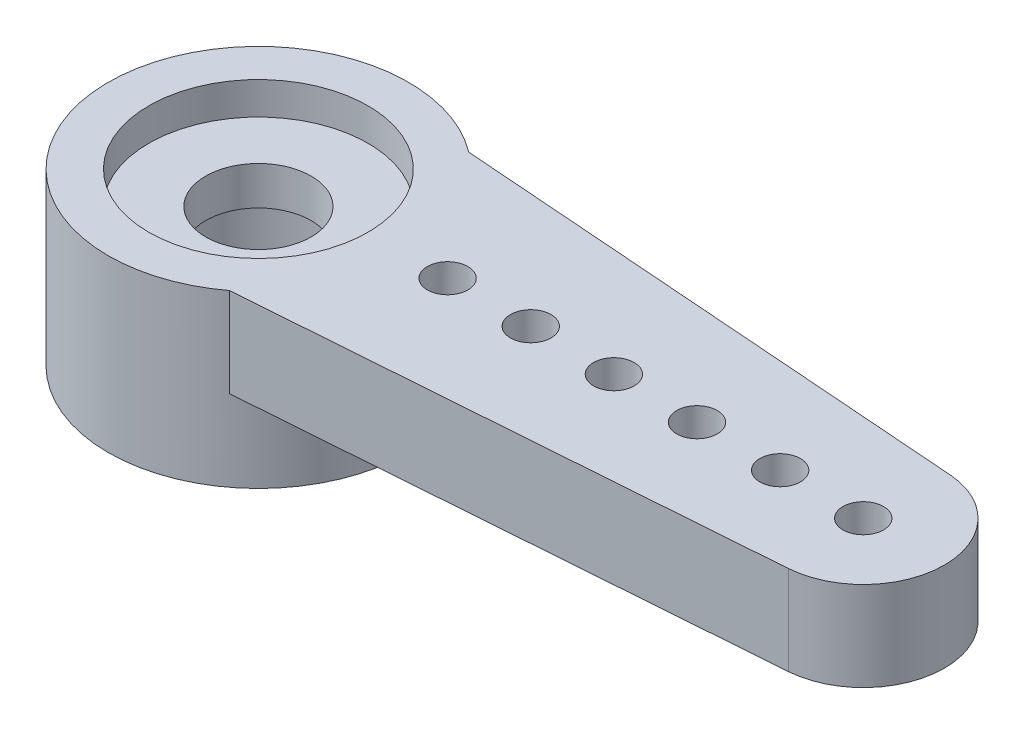
ISO-10303-21;
HEADER;
FILE_DESCRIPTION(('STEP AP214'),'2;1');
FILE_NAME('part.step','',(''),(''),'','','');
FILE_SCHEMA(('AUTOMOTIVE_DESIGN { 1 0 10303 214 1 1 1 1 }'));
ENDSEC;
DATA;
#1=APPLICATION_CONTEXT('core data for automotive mechanical design processes');
#2=APPLICATION_PROTOCOL_DEFINITION('international standard','automotive_design',2000,#1);
#3=PRODUCT_CONTEXT('',#1,'mechanical');
#4=PRODUCT('Part','Part','',(#3));
#5=PRODUCT_RELATED_PRODUCT_CATEGORY('part','',(#4));
#6=PRODUCT_DEFINITION_FORMATION('','',#4);
#7=PRODUCT_DEFINITION_CONTEXT('part definition',#1,'design');
#8=PRODUCT_DEFINITION('design','',#6,#7);
#9=PRODUCT_DEFINITION_SHAPE('','',#8);
#10=(LENGTH_UNIT() NAMED_UNIT(*) SI_UNIT(.MILLI.,.METRE.));
#11=(NAMED_UNIT(*) PLANE_ANGLE_UNIT() SI_UNIT($,.RADIAN.));
#12=(NAMED_UNIT(*) SI_UNIT($,.STERADIAN.) SOLID_ANGLE_UNIT());
#13=UNCERTAINTY_MEASURE_WITH_UNIT(LENGTH_MEASURE(1.E-05),#10,'distance_accuracy_value','');
#14=(GEOMETRIC_REPRESENTATION_CONTEXT(3) GLOBAL_UNCERTAINTY_ASSIGNED_CONTEXT((#13)) GLOBAL_UNIT_ASSIGNED_CONTEXT((#10,
#11,#12)) REPRESENTATION_CONTEXT('',''));
#15=CARTESIAN_POINT('',(0.,0.,0.));
#16=DIRECTION('',(0.,0.,1.));
#17=DIRECTION('',(1.,0.,0.));
#18=AXIS2_PLACEMENT_3D('',#15,#16,#17);
#19=CARTESIAN_POINT('',(0.,55.,0.));
#20=DIRECTION('',(0.,1.,0.));
#21=DIRECTION('',(0.,0.,1.));
#22=AXIS2_PLACEMENT_3D('',#19,#20,#21);
#23=CYLINDRICAL_SURFACE('',#22,3.7);
#24=CARTESIAN_POINT('',(0.,-2.,0.));
#25=DIRECTION('',(0.,1.,0.));
#26=DIRECTION('',(0.,0.,1.));
#27=AXIS2_PLACEMENT_3D('',#24,#25,#26);
#28=CIRCLE('',#27,3.7);
#29=CARTESIAN_POINT('',(0.,-2.,3.7));
#30=VERTEX_POINT('',#29);
#31=EDGE_CURVE('E152',#30,#30,#28,.T.);
#32=ORIENTED_EDGE('',*,*,#31,.T.);
#33=EDGE_LOOP('',(#32));
#34=FACE_BOUND('',#33,.T.);
#35=DIRECTION('',(0.,-1.,0.));
#36=VECTOR('',#35,1.);
#37=CARTESIAN_POINT('',(2.23327114341273,17.1604624043727,-2.95));
#38=LINE('',#37,#36);
#39=CARTESIAN_POINT('',(2.23327114341273,2.2,-2.95));
#40=VERTEX_POINT('',#39);
#41=CARTESIAN_POINT('',(2.23327114341273,0.,-2.95));
#42=VERTEX_POINT('',#41);
#43=EDGE_CURVE('E98',#40,#42,#38,.T.);
#44=ORIENTED_EDGE('',*,*,#43,.T.);
#45=CARTESIAN_POINT('',(0.,0.,0.));
#46=DIRECTION('',(0.,1.,0.));
#47=DIRECTION('',(0.,0.,1.));
#48=AXIS2_PLACEMENT_3D('',#45,#46,#47);
#49=CIRCLE('',#48,3.7);
#50=CARTESIAN_POINT('',(2.23327114341273,0.,2.95));
#51=VERTEX_POINT('',#50);
#52=EDGE_CURVE('E103',#51,#42,#49,.T.);
#53=ORIENTED_EDGE('',*,*,#52,.F.);
#54=DIRECTION('',(0.,-1.,0.));
#55=VECTOR('',#54,1.);
#56=CARTESIAN_POINT('',(2.23327114341273,17.1604624043727,2.95));
#57=LINE('',#56,#55);
#58=CARTESIAN_POINT('',(2.23327114341273,2.2,2.95));
#59=VERTEX_POINT('',#58);
#60=EDGE_CURVE('E112',#59,#51,#57,.T.);
#61=ORIENTED_EDGE('',*,*,#60,.F.);
#62=CARTESIAN_POINT('',(0.,2.2,0.));
#63=DIRECTION('',(0.,1.,0.));
#64=DIRECTION('',(0.,0.,1.));
#65=AXIS2_PLACEMENT_3D('',#62,#63,#64);
#66=CIRCLE('',#65,3.7);
#67=EDGE_CURVE('E58',#40,#59,#66,.T.);
#68=ORIENTED_EDGE('',*,*,#67,.F.);
#69=EDGE_LOOP('',(#44,#53,#61,#68));
#70=FACE_BOUND('',#69,.T.);
#71=ADVANCED_FACE('F38',(#34,#70),#23,.T.);
#72=CARTESIAN_POINT('',(3.7,2.2,0.));
#73=DIRECTION('',(0.,-1.,0.));
#74=DIRECTION('',(0.,0.,-1.));
#75=AXIS2_PLACEMENT_3D('',#72,#73,#74);
#76=PLANE('',#75);
#77=DIRECTION('',(-0.997231839723,0.,-0.0743549449780045));
#78=VECTOR('',#77,1.);
#79=CARTESIAN_POINT('',(0.231086891811972,2.2,-3.09928554618247));
#80=LINE('',#79,#78);
#81=CARTESIAN_POINT('',(15.048709889956,2.2,-1.994463679446));
#82=VERTEX_POINT('',#81);
#83=EDGE_CURVE('E97',#82,#40,#80,.T.);
#84=ORIENTED_EDGE('',*,*,#83,.T.);
#85=ORIENTED_EDGE('',*,*,#67,.T.);
#86=DIRECTION('',(-0.997231839723,0.,0.0743549449780045));
#87=VECTOR('',#86,1.);
#88=CARTESIAN_POINT('',(0.231086891811972,2.2,3.09928554618247));
#89=LINE('',#88,#87);
#90=CARTESIAN_POINT('',(15.048709889956,2.2,1.994463679446));
#91=VERTEX_POINT('',#90);
#92=EDGE_CURVE('E53',#91,#59,#89,.T.);
#93=ORIENTED_EDGE('',*,*,#92,.F.);
#94=CARTESIAN_POINT('',(14.9,2.2,0.));
#95=DIRECTION('',(0.,-1.,0.));
#96=DIRECTION('',(0.,0.,-1.));
#97=AXIS2_PLACEMENT_3D('',#94,#95,#96);
#98=CIRCLE('',#97,2.);
#99=EDGE_CURVE('E124',#82,#91,#98,.T.);
#100=ORIENTED_EDGE('',*,*,#99,.F.);
#101=EDGE_LOOP('',(#84,#85,#93,#100));
#102=FACE_BOUND('',#101,.T.);
#103=CARTESIAN_POINT('',(14.9,2.2,0.));
#104=DIRECTION('',(0.,-1.,0.));
#105=DIRECTION('',(0.,0.,-1.));
#106=AXIS2_PLACEMENT_3D('',#103,#104,#105);
#107=CIRCLE('',#106,0.500000000000001);
#108=CARTESIAN_POINT('',(14.9,2.2,-0.500000000000001));
#109=VERTEX_POINT('',#108);
#110=EDGE_CURVE('E121',#109,#109,#107,.T.);
#111=ORIENTED_EDGE('',*,*,#110,.T.);
#112=EDGE_LOOP('',(#111));
#113=FACE_BOUND('',#112,.T.);
#114=CARTESIAN_POINT('',(12.8520801303343,2.2,0.));
#115=DIRECTION('',(0.,-1.,0.));
#116=DIRECTION('',(0.,0.,-1.));
#117=AXIS2_PLACEMENT_3D('',#114,#115,#116);
#118=CIRCLE('',#117,0.500000000000001);
#119=CARTESIAN_POINT('',(12.8520801303343,2.2,-0.500000000000002));
#120=VERTEX_POINT('',#119);
#121=EDGE_CURVE('E118',#120,#120,#118,.T.);
#122=ORIENTED_EDGE('',*,*,#121,.T.);
#123=EDGE_LOOP('',(#122));
#124=FACE_BOUND('',#123,.T.);
#125=CARTESIAN_POINT('',(10.8041602606687,2.2,0.));
#126=DIRECTION('',(0.,-1.,0.));
#127=DIRECTION('',(0.,0.,-1.));
#128=AXIS2_PLACEMENT_3D('',#125,#126,#127);
#129=CIRCLE('',#128,0.500000000000001);
#130=CARTESIAN_POINT('',(10.8041602606687,2.2,-0.500000000000002));
#131=VERTEX_POINT('',#130);
#132=EDGE_CURVE('E115',#131,#131,#129,.T.);
#133=ORIENTED_EDGE('',*,*,#132,.T.);
#134=EDGE_LOOP('',(#133));
#135=FACE_BOUND('',#134,.T.);
#136=CARTESIAN_POINT('',(8.75624039100299,2.2,0.));
#137=DIRECTION('',(0.,-1.,0.));
#138=DIRECTION('',(0.,0.,-1.));
#139=AXIS2_PLACEMENT_3D('',#136,#137,#138);
#140=CIRCLE('',#139,0.500000000000001);
#141=CARTESIAN_POINT('',(8.75624039100299,2.2,-0.500000000000002));
#142=VERTEX_POINT('',#141);
#143=EDGE_CURVE('E111',#142,#142,#140,.T.);
#144=ORIENTED_EDGE('',*,*,#143,.T.);
#145=EDGE_LOOP('',(#144));
#146=FACE_BOUND('',#145,.T.);
#147=CARTESIAN_POINT('',(6.70832052133732,2.2,0.));
#148=DIRECTION('',(0.,-1.,0.));
#149=DIRECTION('',(0.,0.,-1.));
#150=AXIS2_PLACEMENT_3D('',#147,#148,#149);
#151=CIRCLE('',#150,0.500000000000001);
#152=CARTESIAN_POINT('',(6.70832052133732,2.2,-0.500000000000001));
#153=VERTEX_POINT('',#152);
#154=EDGE_CURVE('E108',#153,#153,#151,.T.);
#155=ORIENTED_EDGE('',*,*,#154,.T.);
#156=EDGE_LOOP('',(#155));
#157=FACE_BOUND('',#156,.T.);
#158=CARTESIAN_POINT('',(0.,2.2,0.));
#159=DIRECTION('',(0.,1.,0.));
#160=DIRECTION('',(0.,0.,1.));
#161=AXIS2_PLACEMENT_3D('',#158,#159,#160);
#162=CIRCLE('',#161,2.7);
#163=CARTESIAN_POINT('',(0.,2.2,2.7));
#164=VERTEX_POINT('',#163);
#165=EDGE_CURVE('E11',#164,#164,#162,.T.);
#166=ORIENTED_EDGE('',*,*,#165,.F.);
#167=EDGE_LOOP('',(#166));
#168=FACE_BOUND('',#167,.T.);
#169=CARTESIAN_POINT('',(4.66040065167165,2.2,0.));
#170=DIRECTION('',(0.,-1.,0.));
#171=DIRECTION('',(0.,0.,-1.));
#172=AXIS2_PLACEMENT_3D('',#169,#170,#171);
#173=CIRCLE('',#172,0.500000000000001);
#174=CARTESIAN_POINT('',(4.66040065167165,2.2,-0.500000000000002));
#175=VERTEX_POINT('',#174);
#176=EDGE_CURVE('E127',#175,#175,#173,.T.);
#177=ORIENTED_EDGE('',*,*,#176,.T.);
#178=EDGE_LOOP('',(#177));
#179=FACE_BOUND('',#178,.T.);
#180=ADVANCED_FACE('F40',(#102,#113,#124,#135,#146,#157,#168,#179),#76,.F.);
#181=CARTESIAN_POINT('',(0.,55.,0.));
#182=DIRECTION('',(0.,1.,0.));
#183=DIRECTION('',(0.,0.,1.));
#184=AXIS2_PLACEMENT_3D('',#181,#182,#183);
#185=CYLINDRICAL_SURFACE('',#184,2.7);
#186=CARTESIAN_POINT('',(0.,1.4,0.));
#187=DIRECTION('',(0.,1.,0.));
#188=DIRECTION('',(0.,0.,1.));
#189=AXIS2_PLACEMENT_3D('',#186,#187,#188);
#190=CIRCLE('',#189,2.7);
#191=CARTESIAN_POINT('',(0.,1.4,2.7));
#192=VERTEX_POINT('',#191);
#193=EDGE_CURVE('E46',#192,#192,#190,.T.);
#194=ORIENTED_EDGE('',*,*,#193,.F.);
#195=EDGE_LOOP('',(#194));
#196=FACE_BOUND('',#195,.T.);
#197=ORIENTED_EDGE('',*,*,#165,.T.);
#198=EDGE_LOOP('',(#197));
#199=FACE_BOUND('',#198,.T.);
#200=ADVANCED_FACE('F171',(#196,#199),#185,.F.);
#201=CARTESIAN_POINT('',(2.7,1.4,0.));
#202=DIRECTION('',(0.,-1.,0.));
#203=DIRECTION('',(0.,0.,-1.));
#204=AXIS2_PLACEMENT_3D('',#201,#202,#203);
#205=PLANE('',#204);
#206=CARTESIAN_POINT('',(0.,1.4,0.));
#207=DIRECTION('',(0.,1.,0.));
#208=DIRECTION('',(0.,0.,1.));
#209=AXIS2_PLACEMENT_3D('',#206,#207,#208);
#210=CIRCLE('',#209,1.3);
#211=CARTESIAN_POINT('',(0.,1.4,1.3));
#212=VERTEX_POINT('',#211);
#213=EDGE_CURVE('E164',#212,#212,#210,.T.);
#214=ORIENTED_EDGE('',*,*,#213,.F.);
#215=EDGE_LOOP('',(#214));
#216=FACE_BOUND('',#215,.T.);
#217=ORIENTED_EDGE('',*,*,#193,.T.);
#218=EDGE_LOOP('',(#217));
#219=FACE_BOUND('',#218,.T.);
#220=ADVANCED_FACE('F169',(#216,#219),#205,.F.);
#221=CARTESIAN_POINT('',(0.,55.,0.));
#222=DIRECTION('',(0.,1.,0.));
#223=DIRECTION('',(0.,0.,1.));
#224=AXIS2_PLACEMENT_3D('',#221,#222,#223);
#225=CYLINDRICAL_SURFACE('',#224,1.3);
#226=CARTESIAN_POINT('',(0.,0.449999999999999,0.));
#227=DIRECTION('',(0.,1.,0.));
#228=DIRECTION('',(0.,0.,1.));
#229=AXIS2_PLACEMENT_3D('',#226,#227,#228);
#230=CIRCLE('',#229,1.3);
#231=CARTESIAN_POINT('',(0.,0.449999999999999,1.3));
#232=VERTEX_POINT('',#231);
#233=EDGE_CURVE('E161',#232,#232,#230,.T.);
#234=ORIENTED_EDGE('',*,*,#233,.F.);
#235=EDGE_LOOP('',(#234));
#236=FACE_BOUND('',#235,.T.);
#237=ORIENTED_EDGE('',*,*,#213,.T.);
#238=EDGE_LOOP('',(#237));
#239=FACE_BOUND('',#238,.T.);
#240=ADVANCED_FACE('F209',(#236,#239),#225,.F.);
#241=CARTESIAN_POINT('',(1.3,0.45,0.));
#242=DIRECTION('',(0.,1.,0.));
#243=DIRECTION('',(0.,0.,1.));
#244=AXIS2_PLACEMENT_3D('',#241,#242,#243);
#245=PLANE('',#244);
#246=CARTESIAN_POINT('',(0.,0.449999999999999,0.));
#247=DIRECTION('',(0.,1.,0.));
#248=DIRECTION('',(0.,0.,1.));
#249=AXIS2_PLACEMENT_3D('',#246,#247,#248);
#250=CIRCLE('',#249,2.35);
#251=CARTESIAN_POINT('',(0.,0.449999999999999,2.35));
#252=VERTEX_POINT('',#251);
#253=EDGE_CURVE('E158',#252,#252,#250,.T.);
#254=ORIENTED_EDGE('',*,*,#253,.F.);
#255=EDGE_LOOP('',(#254));
#256=FACE_BOUND('',#255,.T.);
#257=ORIENTED_EDGE('',*,*,#233,.T.);
#258=EDGE_LOOP('',(#257));
#259=FACE_BOUND('',#258,.T.);
#260=ADVANCED_FACE('F205',(#256,#259),#245,.F.);
#261=CARTESIAN_POINT('',(0.,55.,0.));
#262=DIRECTION('',(0.,1.,0.));
#263=DIRECTION('',(0.,0.,1.));
#264=AXIS2_PLACEMENT_3D('',#261,#262,#263);
#265=CYLINDRICAL_SURFACE('',#264,2.35);
#266=CARTESIAN_POINT('',(0.,-2.,0.));
#267=DIRECTION('',(0.,1.,0.));
#268=DIRECTION('',(0.,0.,1.));
#269=AXIS2_PLACEMENT_3D('',#266,#267,#268);
#270=CIRCLE('',#269,2.35);
#271=CARTESIAN_POINT('',(0.,-2.,2.35));
#272=VERTEX_POINT('',#271);
#273=EDGE_CURVE('E155',#272,#272,#270,.T.);
#274=ORIENTED_EDGE('',*,*,#273,.F.);
#275=EDGE_LOOP('',(#274));
#276=FACE_BOUND('',#275,.T.);
#277=ORIENTED_EDGE('',*,*,#253,.T.);
#278=EDGE_LOOP('',(#277));
#279=FACE_BOUND('',#278,.T.);
#280=ADVANCED_FACE('F192',(#276,#279),#265,.F.);
#281=CARTESIAN_POINT('',(2.35,-2.,0.));
#282=DIRECTION('',(0.,1.,0.));
#283=DIRECTION('',(0.,0.,1.));
#284=AXIS2_PLACEMENT_3D('',#281,#282,#283);
#285=PLANE('',#284);
#286=ORIENTED_EDGE('',*,*,#31,.F.);
#287=EDGE_LOOP('',(#286));
#288=FACE_BOUND('',#287,.T.);
#289=ORIENTED_EDGE('',*,*,#273,.T.);
#290=EDGE_LOOP('',(#289));
#291=FACE_BOUND('',#290,.T.);
#292=ADVANCED_FACE('F183',(#288,#291),#285,.F.);
#293=CARTESIAN_POINT('',(4.66040065167165,17.1604624043727,0.));
#294=DIRECTION('',(0.,-1.,0.));
#295=DIRECTION('',(0.,0.,-1.));
#296=AXIS2_PLACEMENT_3D('',#293,#294,#295);
#297=CYLINDRICAL_SURFACE('',#296,0.500000000000001);
#298=CARTESIAN_POINT('',(4.66040065167165,0.,0.));
#299=DIRECTION('',(0.,1.,0.));
#300=DIRECTION('',(0.,0.,1.));
#301=AXIS2_PLACEMENT_3D('',#298,#299,#300);
#302=CIRCLE('',#301,0.500000000000001);
#303=CARTESIAN_POINT('',(4.66040065167165,0.,0.499999999999999));
#304=VERTEX_POINT('',#303);
#305=EDGE_CURVE('E130',#304,#304,#302,.T.);
#306=ORIENTED_EDGE('',*,*,#305,.F.);
#307=EDGE_LOOP('',(#306));
#308=FACE_BOUND('',#307,.T.);
#309=ORIENTED_EDGE('',*,*,#176,.F.);
#310=EDGE_LOOP('',(#309));
#311=FACE_BOUND('',#310,.T.);
#312=ADVANCED_FACE('F180',(#308,#311),#297,.F.);
#313=CARTESIAN_POINT('',(0.231086891811972,17.1604624043727,3.09928554618247));
#314=DIRECTION('',(-0.0743549449780045,0.,-0.997231839722999));
#315=DIRECTION('',(-0.997231839723,0.,0.0743549449780045));
#316=AXIS2_PLACEMENT_3D('',#313,#314,#315);
#317=PLANE('',#316);
#318=DIRECTION('',(0.,-1.,0.));
#319=VECTOR('',#318,1.);
#320=CARTESIAN_POINT('',(15.048709889956,17.1604624043727,1.994463679446));
#321=LINE('',#320,#319);
#322=CARTESIAN_POINT('',(15.048709889956,0.,1.994463679446));
#323=VERTEX_POINT('',#322);
#324=EDGE_CURVE('E83',#91,#323,#321,.T.);
#325=ORIENTED_EDGE('',*,*,#324,.F.);
#326=ORIENTED_EDGE('',*,*,#92,.T.);
#327=ORIENTED_EDGE('',*,*,#60,.T.);
#328=DIRECTION('',(0.997231839722999,0.,-0.0743549449780045));
#329=VECTOR('',#328,1.);
#330=CARTESIAN_POINT('',(0.231086891811972,0.,3.09928554618247));
#331=LINE('',#330,#329);
#332=EDGE_CURVE('E89',#51,#323,#331,.T.);
#333=ORIENTED_EDGE('',*,*,#332,.T.);
#334=EDGE_LOOP('',(#325,#326,#327,#333));
#335=FACE_BOUND('',#334,.T.);
#336=ADVANCED_FACE('F182',(#335),#317,.F.);
#337=CARTESIAN_POINT('',(14.9,17.1604624043727,0.));
#338=DIRECTION('',(0.,-1.,0.));
#339=DIRECTION('',(0.,0.,-1.));
#340=AXIS2_PLACEMENT_3D('',#337,#338,#339);
#341=CYLINDRICAL_SURFACE('',#340,2.);
#342=CARTESIAN_POINT('',(14.9,0.,0.));
#343=DIRECTION('',(0.,1.,0.));
#344=DIRECTION('',(0.,0.,1.));
#345=AXIS2_PLACEMENT_3D('',#342,#343,#344);
#346=CIRCLE('',#345,2.);
#347=CARTESIAN_POINT('',(15.048709889956,0.,-1.994463679446));
#348=VERTEX_POINT('',#347);
#349=EDGE_CURVE('E77',#323,#348,#346,.T.);
#350=ORIENTED_EDGE('',*,*,#349,.T.);
#351=DIRECTION('',(0.,-1.,0.));
#352=VECTOR('',#351,1.);
#353=CARTESIAN_POINT('',(15.048709889956,17.1604624043727,-1.994463679446));
#354=LINE('',#353,#352);
#355=EDGE_CURVE('E80',#82,#348,#354,.T.);
#356=ORIENTED_EDGE('',*,*,#355,.F.);
#357=ORIENTED_EDGE('',*,*,#99,.T.);
#358=ORIENTED_EDGE('',*,*,#324,.T.);
#359=EDGE_LOOP('',(#350,#356,#357,#358));
#360=FACE_BOUND('',#359,.T.);
#361=ADVANCED_FACE('F79',(#360),#341,.T.);
#362=CARTESIAN_POINT('',(14.9,17.1604624043727,0.));
#363=DIRECTION('',(0.,-1.,0.));
#364=DIRECTION('',(0.,0.,-1.));
#365=AXIS2_PLACEMENT_3D('',#362,#363,#364);
#366=CYLINDRICAL_SURFACE('',#365,0.500000000000001);
#367=CARTESIAN_POINT('',(14.9,0.,0.));
#368=DIRECTION('',(0.,1.,0.));
#369=DIRECTION('',(0.,0.,1.));
#370=AXIS2_PLACEMENT_3D('',#367,#368,#369);
#371=CIRCLE('',#370,0.500000000000001);
#372=CARTESIAN_POINT('',(14.9,0.,0.500000000000001));
#373=VERTEX_POINT('',#372);
#374=EDGE_CURVE('E88',#373,#373,#371,.T.);
#375=ORIENTED_EDGE('',*,*,#374,.F.);
#376=EDGE_LOOP('',(#375));
#377=FACE_BOUND('',#376,.T.);
#378=ORIENTED_EDGE('',*,*,#110,.F.);
#379=EDGE_LOOP('',(#378));
#380=FACE_BOUND('',#379,.T.);
#381=ADVANCED_FACE('F271',(#377,#380),#366,.F.);
#382=CARTESIAN_POINT('',(12.8520801303343,17.1604624043727,0.));
#383=DIRECTION('',(0.,-1.,0.));
#384=DIRECTION('',(0.,0.,-1.));
#385=AXIS2_PLACEMENT_3D('',#382,#383,#384);
#386=CYLINDRICAL_SURFACE('',#385,0.500000000000001);
#387=CARTESIAN_POINT('',(12.8520801303343,0.,0.));
#388=DIRECTION('',(0.,1.,0.));
#389=DIRECTION('',(0.,0.,1.));
#390=AXIS2_PLACEMENT_3D('',#387,#388,#389);
#391=CIRCLE('',#390,0.500000000000001);
#392=CARTESIAN_POINT('',(12.8520801303343,0.,0.499999999999999));
#393=VERTEX_POINT('',#392);
#394=EDGE_CURVE('E137',#393,#393,#391,.T.);
#395=ORIENTED_EDGE('',*,*,#394,.F.);
#396=EDGE_LOOP('',(#395));
#397=FACE_BOUND('',#396,.T.);
#398=ORIENTED_EDGE('',*,*,#121,.F.);
#399=EDGE_LOOP('',(#398));
#400=FACE_BOUND('',#399,.T.);
#401=ADVANCED_FACE('F280',(#397,#400),#386,.F.);
#402=CARTESIAN_POINT('',(10.8041602606687,17.1604624043727,0.));
#403=DIRECTION('',(0.,-1.,0.));
#404=DIRECTION('',(0.,0.,-1.));
#405=AXIS2_PLACEMENT_3D('',#402,#403,#404);
#406=CYLINDRICAL_SURFACE('',#405,0.500000000000001);
#407=CARTESIAN_POINT('',(10.8041602606687,0.,0.));
#408=DIRECTION('',(0.,1.,0.));
#409=DIRECTION('',(0.,0.,1.));
#410=AXIS2_PLACEMENT_3D('',#407,#408,#409);
#411=CIRCLE('',#410,0.500000000000001);
#412=CARTESIAN_POINT('',(10.8041602606687,0.,0.499999999999999));
#413=VERTEX_POINT('',#412);
#414=EDGE_CURVE('E140',#413,#413,#411,.T.);
#415=ORIENTED_EDGE('',*,*,#414,.F.);
#416=EDGE_LOOP('',(#415));
#417=FACE_BOUND('',#416,.T.);
#418=ORIENTED_EDGE('',*,*,#132,.F.);
#419=EDGE_LOOP('',(#418));
#420=FACE_BOUND('',#419,.T.);
#421=ADVANCED_FACE('F291',(#417,#420),#406,.F.);
#422=CARTESIAN_POINT('',(8.75624039100299,17.1604624043727,0.));
#423=DIRECTION('',(0.,-1.,0.));
#424=DIRECTION('',(0.,0.,-1.));
#425=AXIS2_PLACEMENT_3D('',#422,#423,#424);
#426=CYLINDRICAL_SURFACE('',#425,0.500000000000001);
#427=CARTESIAN_POINT('',(8.75624039100299,0.,0.));
#428=DIRECTION('',(0.,1.,0.));
#429=DIRECTION('',(0.,0.,1.));
#430=AXIS2_PLACEMENT_3D('',#427,#428,#429);
#431=CIRCLE('',#430,0.500000000000001);
#432=CARTESIAN_POINT('',(8.75624039100299,0.,0.499999999999999));
#433=VERTEX_POINT('',#432);
#434=EDGE_CURVE('E143',#433,#433,#431,.T.);
#435=ORIENTED_EDGE('',*,*,#434,.F.);
#436=EDGE_LOOP('',(#435));
#437=FACE_BOUND('',#436,.T.);
#438=ORIENTED_EDGE('',*,*,#143,.F.);
#439=EDGE_LOOP('',(#438));
#440=FACE_BOUND('',#439,.T.);
#441=ADVANCED_FACE('F302',(#437,#440),#426,.F.);
#442=CARTESIAN_POINT('',(6.70832052133732,17.1604624043727,0.));
#443=DIRECTION('',(0.,-1.,0.));
#444=DIRECTION('',(0.,0.,-1.));
#445=AXIS2_PLACEMENT_3D('',#442,#443,#444);
#446=CYLINDRICAL_SURFACE('',#445,0.500000000000001);
#447=CARTESIAN_POINT('',(6.70832052133732,0.,0.));
#448=DIRECTION('',(0.,1.,0.));
#449=DIRECTION('',(0.,0.,1.));
#450=AXIS2_PLACEMENT_3D('',#447,#448,#449);
#451=CIRCLE('',#450,0.500000000000001);
#452=CARTESIAN_POINT('',(6.70832052133732,0.,0.500000000000001));
#453=VERTEX_POINT('',#452);
#454=EDGE_CURVE('E146',#453,#453,#451,.T.);
#455=ORIENTED_EDGE('',*,*,#454,.F.);
#456=EDGE_LOOP('',(#455));
#457=FACE_BOUND('',#456,.T.);
#458=ORIENTED_EDGE('',*,*,#154,.F.);
#459=EDGE_LOOP('',(#458));
#460=FACE_BOUND('',#459,.T.);
#461=ADVANCED_FACE('F313',(#457,#460),#446,.F.);
#462=CARTESIAN_POINT('',(0.,0.,0.));
#463=DIRECTION('',(0.,1.,0.));
#464=DIRECTION('',(0.,0.,1.));
#465=AXIS2_PLACEMENT_3D('',#462,#463,#464);
#466=PLANE('',#465);
#467=ORIENTED_EDGE('',*,*,#305,.T.);
#468=EDGE_LOOP('',(#467));
#469=FACE_BOUND('',#468,.T.);
#470=DIRECTION('',(0.997231839722999,0.,0.0743549449780045));
#471=VECTOR('',#470,1.);
#472=CARTESIAN_POINT('',(0.231086891811972,0.,-3.09928554618247));
#473=LINE('',#472,#471);
#474=EDGE_CURVE('E95',#42,#348,#473,.T.);
#475=ORIENTED_EDGE('',*,*,#474,.T.);
#476=ORIENTED_EDGE('',*,*,#349,.F.);
#477=ORIENTED_EDGE('',*,*,#332,.F.);
#478=ORIENTED_EDGE('',*,*,#52,.T.);
#479=EDGE_LOOP('',(#475,#476,#477,#478));
#480=FACE_BOUND('',#479,.T.);
#481=ORIENTED_EDGE('',*,*,#374,.T.);
#482=EDGE_LOOP('',(#481));
#483=FACE_BOUND('',#482,.T.);
#484=ORIENTED_EDGE('',*,*,#394,.T.);
#485=EDGE_LOOP('',(#484));
#486=FACE_BOUND('',#485,.T.);
#487=ORIENTED_EDGE('',*,*,#414,.T.);
#488=EDGE_LOOP('',(#487));
#489=FACE_BOUND('',#488,.T.);
#490=ORIENTED_EDGE('',*,*,#434,.T.);
#491=EDGE_LOOP('',(#490));
#492=FACE_BOUND('',#491,.T.);
#493=ORIENTED_EDGE('',*,*,#454,.T.);
#494=EDGE_LOOP('',(#493));
#495=FACE_BOUND('',#494,.T.);
#496=ADVANCED_FACE('F100',(#469,#480,#483,#486,#489,#492,#495),#466,.F.);
#497=CARTESIAN_POINT('',(0.231086891811972,17.1604624043727,-3.09928554618247));
#498=DIRECTION('',(0.0743549449780045,0.,-0.997231839722999));
#499=DIRECTION('',(-0.997231839723,0.,-0.0743549449780045));
#500=AXIS2_PLACEMENT_3D('',#497,#498,#499);
#501=PLANE('',#500);
#502=ORIENTED_EDGE('',*,*,#83,.F.);
#503=ORIENTED_EDGE('',*,*,#355,.T.);
#504=ORIENTED_EDGE('',*,*,#474,.F.);
#505=ORIENTED_EDGE('',*,*,#43,.F.);
#506=EDGE_LOOP('',(#502,#503,#504,#505));
#507=FACE_BOUND('',#506,.T.);
#508=ADVANCED_FACE('F93',(#507),#501,.T.);
#509=CLOSED_SHELL('',(#71,#180,#200,#220,#240,#260,#280,#292,#312,#336,#361,#381,#401,#421,#441,
#461,#496,#508));
#510=MANIFOLD_SOLID_BREP('B2',#509);
#511=ADVANCED_BREP_SHAPE_REPRESENTATION('',(#18,#510),#14);
#512=SHAPE_DEFINITION_REPRESENTATION(#9,#511);
ENDSEC;
END-ISO-10303-21;
